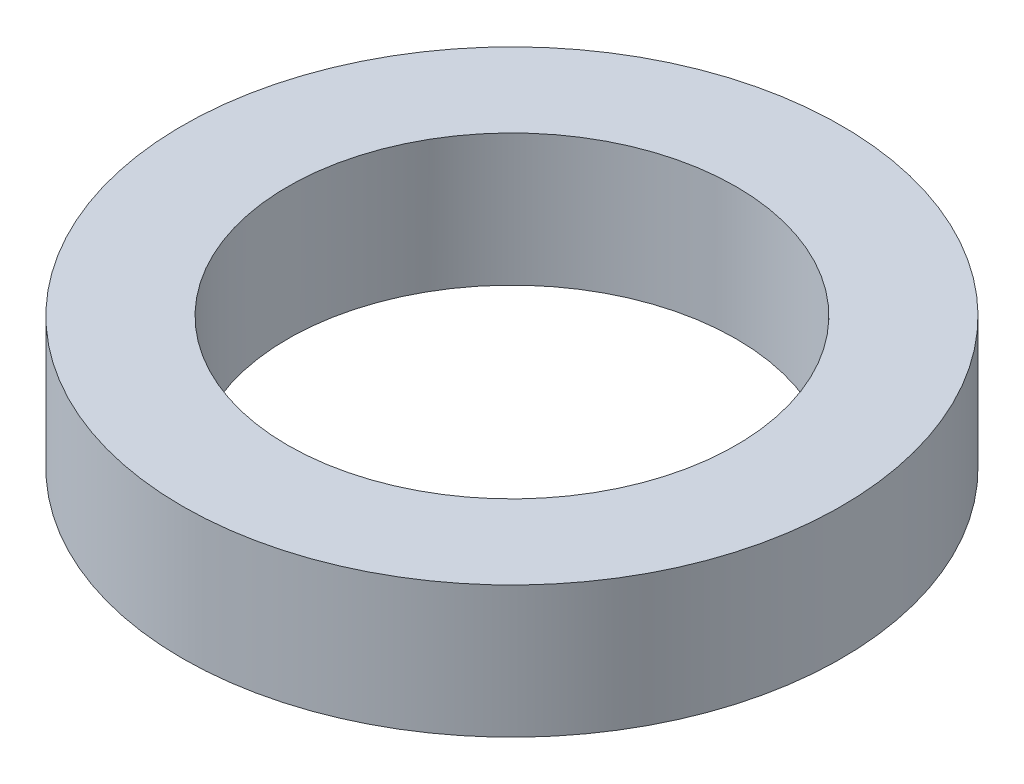
ISO-10303-21;
HEADER;
FILE_DESCRIPTION(('STEP AP214'),'2;1');
FILE_NAME('part.step','',(''),(''),'','','');
FILE_SCHEMA(('AUTOMOTIVE_DESIGN { 1 0 10303 214 1 1 1 1 }'));
ENDSEC;
DATA;
#1=APPLICATION_CONTEXT('core data for automotive mechanical design processes');
#2=APPLICATION_PROTOCOL_DEFINITION('international standard','automotive_design',2000,#1);
#3=PRODUCT_CONTEXT('',#1,'mechanical');
#4=PRODUCT('Part','Part','',(#3));
#5=PRODUCT_RELATED_PRODUCT_CATEGORY('part','',(#4));
#6=PRODUCT_DEFINITION_FORMATION('','',#4);
#7=PRODUCT_DEFINITION_CONTEXT('part definition',#1,'design');
#8=PRODUCT_DEFINITION('design','',#6,#7);
#9=PRODUCT_DEFINITION_SHAPE('','',#8);
#10=(LENGTH_UNIT() NAMED_UNIT(*) SI_UNIT(.MILLI.,.METRE.));
#11=(NAMED_UNIT(*) PLANE_ANGLE_UNIT() SI_UNIT($,.RADIAN.));
#12=(NAMED_UNIT(*) SI_UNIT($,.STERADIAN.) SOLID_ANGLE_UNIT());
#13=UNCERTAINTY_MEASURE_WITH_UNIT(LENGTH_MEASURE(1.E-05),#10,'distance_accuracy_value','');
#14=(GEOMETRIC_REPRESENTATION_CONTEXT(3) GLOBAL_UNCERTAINTY_ASSIGNED_CONTEXT((#13)) GLOBAL_UNIT_ASSIGNED_CONTEXT((#10,
#11,#12)) REPRESENTATION_CONTEXT('',''));
#15=CARTESIAN_POINT('',(0.,0.,0.));
#16=DIRECTION('',(0.,0.,1.));
#17=DIRECTION('',(1.,0.,0.));
#18=AXIS2_PLACEMENT_3D('',#15,#16,#17);
#19=CARTESIAN_POINT('',(0.,1.,0.));
#20=DIRECTION('',(0.,-1.,0.));
#21=DIRECTION('',(0.,0.,-1.));
#22=AXIS2_PLACEMENT_3D('',#19,#20,#21);
#23=CYLINDRICAL_SURFACE('',#22,2.5);
#24=CARTESIAN_POINT('',(0.,1.,0.));
#25=DIRECTION('',(0.,1.,0.));
#26=DIRECTION('',(0.,0.,1.));
#27=AXIS2_PLACEMENT_3D('',#24,#25,#26);
#28=CIRCLE('',#27,2.5);
#29=CARTESIAN_POINT('',(0.,1.,2.5));
#30=VERTEX_POINT('',#29);
#31=EDGE_CURVE('E10',#30,#30,#28,.T.);
#32=ORIENTED_EDGE('',*,*,#31,.F.);
#33=EDGE_LOOP('',(#32));
#34=FACE_BOUND('',#33,.T.);
#35=CARTESIAN_POINT('',(0.,0.,0.));
#36=DIRECTION('',(0.,1.,0.));
#37=DIRECTION('',(0.,0.,1.));
#38=AXIS2_PLACEMENT_3D('',#35,#36,#37);
#39=CIRCLE('',#38,2.5);
#40=CARTESIAN_POINT('',(0.,0.,2.5));
#41=VERTEX_POINT('',#40);
#42=EDGE_CURVE('E34',#41,#41,#39,.T.);
#43=ORIENTED_EDGE('',*,*,#42,.T.);
#44=EDGE_LOOP('',(#43));
#45=FACE_BOUND('',#44,.T.);
#46=ADVANCED_FACE('F31',(#34,#45),#23,.T.);
#47=CARTESIAN_POINT('',(0.,1.,0.));
#48=DIRECTION('',(0.,1.,0.));
#49=DIRECTION('',(0.,0.,1.));
#50=AXIS2_PLACEMENT_3D('',#47,#48,#49);
#51=PLANE('',#50);
#52=CARTESIAN_POINT('',(0.,1.,0.));
#53=DIRECTION('',(0.,1.,0.));
#54=DIRECTION('',(0.,0.,1.));
#55=AXIS2_PLACEMENT_3D('',#52,#53,#54);
#56=CIRCLE('',#55,1.7);
#57=CARTESIAN_POINT('',(0.,1.,1.7));
#58=VERTEX_POINT('',#57);
#59=EDGE_CURVE('E41',#58,#58,#56,.T.);
#60=ORIENTED_EDGE('',*,*,#59,.F.);
#61=EDGE_LOOP('',(#60));
#62=FACE_BOUND('',#61,.T.);
#63=ORIENTED_EDGE('',*,*,#31,.T.);
#64=EDGE_LOOP('',(#63));
#65=FACE_BOUND('',#64,.T.);
#66=ADVANCED_FACE('F54',(#62,#65),#51,.T.);
#67=CARTESIAN_POINT('',(0.,0.,0.));
#68=DIRECTION('',(0.,1.,0.));
#69=DIRECTION('',(0.,0.,1.));
#70=AXIS2_PLACEMENT_3D('',#67,#68,#69);
#71=PLANE('',#70);
#72=CARTESIAN_POINT('',(0.,0.,0.));
#73=DIRECTION('',(0.,-1.,0.));
#74=DIRECTION('',(0.,0.,-1.));
#75=AXIS2_PLACEMENT_3D('',#72,#73,#74);
#76=CIRCLE('',#75,1.7);
#77=CARTESIAN_POINT('',(0.,0.,-1.7));
#78=VERTEX_POINT('',#77);
#79=EDGE_CURVE('E45',#78,#78,#76,.T.);
#80=ORIENTED_EDGE('',*,*,#79,.F.);
#81=EDGE_LOOP('',(#80));
#82=FACE_BOUND('',#81,.T.);
#83=ORIENTED_EDGE('',*,*,#42,.F.);
#84=EDGE_LOOP('',(#83));
#85=FACE_BOUND('',#84,.T.);
#86=ADVANCED_FACE('F51',(#82,#85),#71,.F.);
#87=CARTESIAN_POINT('',(0.,0.,0.));
#88=DIRECTION('',(0.,-1.,0.));
#89=DIRECTION('',(0.,0.,-1.));
#90=AXIS2_PLACEMENT_3D('',#87,#88,#89);
#91=CYLINDRICAL_SURFACE('',#90,1.7);
#92=ORIENTED_EDGE('',*,*,#59,.T.);
#93=EDGE_LOOP('',(#92));
#94=FACE_BOUND('',#93,.T.);
#95=ORIENTED_EDGE('',*,*,#79,.T.);
#96=EDGE_LOOP('',(#95));
#97=FACE_BOUND('',#96,.T.);
#98=ADVANCED_FACE('F49',(#94,#97),#91,.F.);
#99=CLOSED_SHELL('',(#46,#66,#86,#98));
#100=MANIFOLD_SOLID_BREP('B2',#99);
#101=ADVANCED_BREP_SHAPE_REPRESENTATION('',(#18,#100),#14);
#102=SHAPE_DEFINITION_REPRESENTATION(#9,#101);
ENDSEC;
END-ISO-10303-21;
